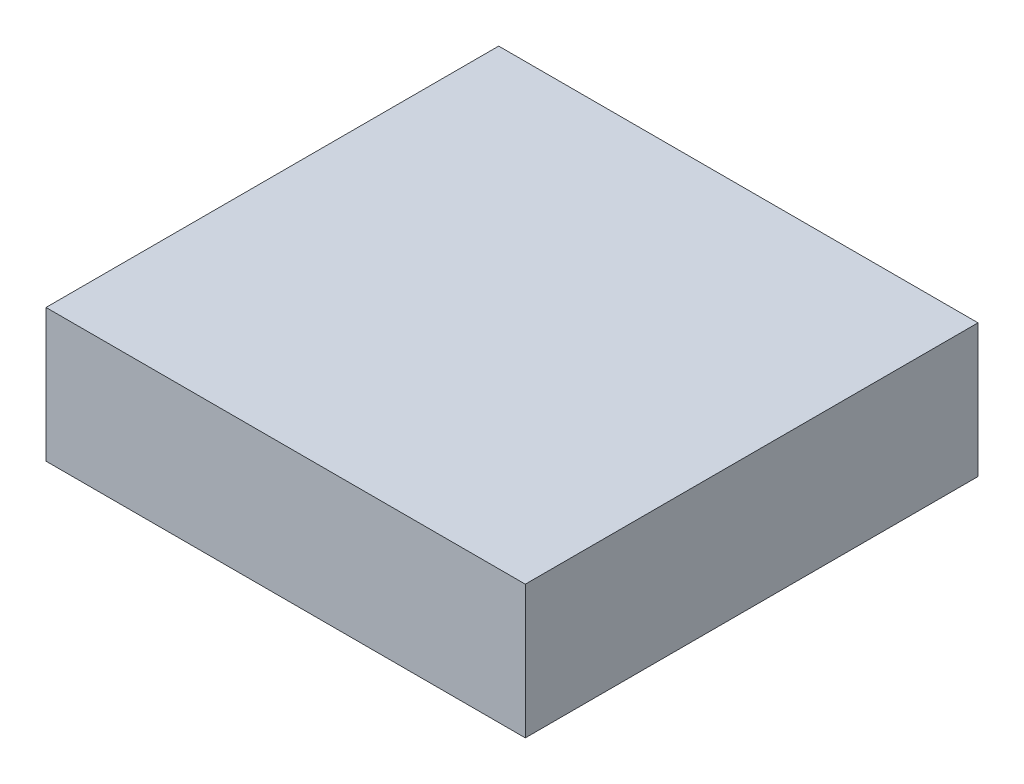
ISO-10303-21;
HEADER;
FILE_DESCRIPTION(('STEP AP214'),'2;1');
FILE_NAME('part.step','',(''),(''),'','','');
FILE_SCHEMA(('AUTOMOTIVE_DESIGN { 1 0 10303 214 1 1 1 1 }'));
ENDSEC;
DATA;
#1=APPLICATION_CONTEXT('core data for automotive mechanical design processes');
#2=APPLICATION_PROTOCOL_DEFINITION('international standard','automotive_design',2000,#1);
#3=PRODUCT_CONTEXT('',#1,'mechanical');
#4=PRODUCT('Part','Part','',(#3));
#5=PRODUCT_RELATED_PRODUCT_CATEGORY('part','',(#4));
#6=PRODUCT_DEFINITION_FORMATION('','',#4);
#7=PRODUCT_DEFINITION_CONTEXT('part definition',#1,'design');
#8=PRODUCT_DEFINITION('design','',#6,#7);
#9=PRODUCT_DEFINITION_SHAPE('','',#8);
#10=(LENGTH_UNIT() NAMED_UNIT(*) SI_UNIT(.MILLI.,.METRE.));
#11=(NAMED_UNIT(*) PLANE_ANGLE_UNIT() SI_UNIT($,.RADIAN.));
#12=(NAMED_UNIT(*) SI_UNIT($,.STERADIAN.) SOLID_ANGLE_UNIT());
#13=UNCERTAINTY_MEASURE_WITH_UNIT(LENGTH_MEASURE(1.E-05),#10,'distance_accuracy_value','');
#14=(GEOMETRIC_REPRESENTATION_CONTEXT(3) GLOBAL_UNCERTAINTY_ASSIGNED_CONTEXT((#13)) GLOBAL_UNIT_ASSIGNED_CONTEXT((#10,
#11,#12)) REPRESENTATION_CONTEXT('',''));
#15=CARTESIAN_POINT('',(0.,0.,0.));
#16=DIRECTION('',(0.,0.,1.));
#17=DIRECTION('',(1.,0.,0.));
#18=AXIS2_PLACEMENT_3D('',#15,#16,#17);
#19=CARTESIAN_POINT('',(-0.8999982,-0.2499995,1.69999914));
#20=DIRECTION('',(0.,0.,-1.));
#21=DIRECTION('',(0.,-1.,0.));
#22=AXIS2_PLACEMENT_3D('',#19,#20,#21);
#23=PLANE('',#22);
#24=DIRECTION('',(1.,0.,0.));
#25=VECTOR('',#24,1.);
#26=CARTESIAN_POINT('',(-0.8999982,-0.2499995,1.69999914));
#27=LINE('',#26,#25);
#28=CARTESIAN_POINT('',(-0.8999982,-0.2499995,1.69999914));
#29=VERTEX_POINT('',#28);
#30=CARTESIAN_POINT('',(0.90000074,-0.2499995,1.69999914));
#31=VERTEX_POINT('',#30);
#32=EDGE_CURVE('E88',#29,#31,#27,.T.);
#33=ORIENTED_EDGE('',*,*,#32,.T.);
#34=DIRECTION('',(0.,1.,0.));
#35=VECTOR('',#34,1.);
#36=CARTESIAN_POINT('',(0.90000074,-0.2499995,1.69999914));
#37=LINE('',#36,#35);
#38=CARTESIAN_POINT('',(0.90000074,0.25000204,1.69999914));
#39=VERTEX_POINT('',#38);
#40=EDGE_CURVE('E62',#31,#39,#37,.T.);
#41=ORIENTED_EDGE('',*,*,#40,.T.);
#42=DIRECTION('',(-1.,0.,0.));
#43=VECTOR('',#42,1.);
#44=CARTESIAN_POINT('',(0.90000074,0.25000204,1.69999914));
#45=LINE('',#44,#43);
#46=CARTESIAN_POINT('',(-0.8999982,0.25000204,1.69999914));
#47=VERTEX_POINT('',#46);
#48=EDGE_CURVE('E80',#39,#47,#45,.T.);
#49=ORIENTED_EDGE('',*,*,#48,.T.);
#50=DIRECTION('',(0.,-1.,0.));
#51=VECTOR('',#50,1.);
#52=CARTESIAN_POINT('',(-0.8999982,0.25000204,1.69999914));
#53=LINE('',#52,#51);
#54=EDGE_CURVE('E11',#47,#29,#53,.T.);
#55=ORIENTED_EDGE('',*,*,#54,.T.);
#56=EDGE_LOOP('',(#33,#41,#49,#55));
#57=FACE_BOUND('',#56,.T.);
#58=ADVANCED_FACE('F16',(#57),#23,.F.);
#59=CARTESIAN_POINT('',(-0.8999982,-0.2499995,0.));
#60=DIRECTION('',(0.,0.,-1.));
#61=DIRECTION('',(0.,-1.,0.));
#62=AXIS2_PLACEMENT_3D('',#59,#60,#61);
#63=PLANE('',#62);
#64=DIRECTION('',(0.,-1.,0.));
#65=VECTOR('',#64,1.);
#66=CARTESIAN_POINT('',(-0.8999982,0.25000204,0.));
#67=LINE('',#66,#65);
#68=CARTESIAN_POINT('',(-0.8999982,0.25000204,0.));
#69=VERTEX_POINT('',#68);
#70=CARTESIAN_POINT('',(-0.8999982,-0.2499995,0.));
#71=VERTEX_POINT('',#70);
#72=EDGE_CURVE('E27',#69,#71,#67,.T.);
#73=ORIENTED_EDGE('',*,*,#72,.F.);
#74=DIRECTION('',(-1.,0.,0.));
#75=VECTOR('',#74,1.);
#76=CARTESIAN_POINT('',(0.90000074,0.25000204,0.));
#77=LINE('',#76,#75);
#78=CARTESIAN_POINT('',(0.90000074,0.25000204,0.));
#79=VERTEX_POINT('',#78);
#80=EDGE_CURVE('E20',#79,#69,#77,.T.);
#81=ORIENTED_EDGE('',*,*,#80,.F.);
#82=DIRECTION('',(0.,1.,0.));
#83=VECTOR('',#82,1.);
#84=CARTESIAN_POINT('',(0.90000074,-0.2499995,0.));
#85=LINE('',#84,#83);
#86=CARTESIAN_POINT('',(0.90000074,-0.2499995,0.));
#87=VERTEX_POINT('',#86);
#88=EDGE_CURVE('E93',#87,#79,#85,.T.);
#89=ORIENTED_EDGE('',*,*,#88,.F.);
#90=DIRECTION('',(1.,0.,0.));
#91=VECTOR('',#90,1.);
#92=CARTESIAN_POINT('',(-0.8999982,-0.2499995,0.));
#93=LINE('',#92,#91);
#94=EDGE_CURVE('E108',#71,#87,#93,.T.);
#95=ORIENTED_EDGE('',*,*,#94,.F.);
#96=EDGE_LOOP('',(#73,#81,#89,#95));
#97=FACE_BOUND('',#96,.T.);
#98=ADVANCED_FACE('F171',(#97),#63,.T.);
#99=CARTESIAN_POINT('',(-0.8999982,0.25000204,0.));
#100=DIRECTION('',(1.,0.,0.));
#101=DIRECTION('',(0.,1.,0.));
#102=AXIS2_PLACEMENT_3D('',#99,#100,#101);
#103=PLANE('',#102);
#104=ORIENTED_EDGE('',*,*,#72,.T.);
#105=DIRECTION('',(0.,0.,1.));
#106=VECTOR('',#105,1.);
#107=CARTESIAN_POINT('',(-0.8999982,-0.2499995,0.));
#108=LINE('',#107,#106);
#109=EDGE_CURVE('E100',#71,#29,#108,.T.);
#110=ORIENTED_EDGE('',*,*,#109,.T.);
#111=ORIENTED_EDGE('',*,*,#54,.F.);
#112=DIRECTION('',(0.,0.,1.));
#113=VECTOR('',#112,1.);
#114=CARTESIAN_POINT('',(-0.8999982,0.25000204,0.));
#115=LINE('',#114,#113);
#116=EDGE_CURVE('E84',#69,#47,#115,.T.);
#117=ORIENTED_EDGE('',*,*,#116,.F.);
#118=EDGE_LOOP('',(#104,#110,#111,#117));
#119=FACE_BOUND('',#118,.T.);
#120=ADVANCED_FACE('F18',(#119),#103,.F.);
#121=CARTESIAN_POINT('',(0.90000074,0.25000204,0.));
#122=DIRECTION('',(0.,-1.,0.));
#123=DIRECTION('',(0.,0.,-1.));
#124=AXIS2_PLACEMENT_3D('',#121,#122,#123);
#125=PLANE('',#124);
#126=ORIENTED_EDGE('',*,*,#80,.T.);
#127=ORIENTED_EDGE('',*,*,#116,.T.);
#128=ORIENTED_EDGE('',*,*,#48,.F.);
#129=DIRECTION('',(0.,0.,1.));
#130=VECTOR('',#129,1.);
#131=CARTESIAN_POINT('',(0.90000074,0.25000204,0.));
#132=LINE('',#131,#130);
#133=EDGE_CURVE('E82',#79,#39,#132,.T.);
#134=ORIENTED_EDGE('',*,*,#133,.F.);
#135=EDGE_LOOP('',(#126,#127,#128,#134));
#136=FACE_BOUND('',#135,.T.);
#137=ADVANCED_FACE('F81',(#136),#125,.F.);
#138=CARTESIAN_POINT('',(0.90000074,-0.2499995,0.));
#139=DIRECTION('',(-1.,0.,0.));
#140=DIRECTION('',(0.,0.,1.));
#141=AXIS2_PLACEMENT_3D('',#138,#139,#140);
#142=PLANE('',#141);
#143=ORIENTED_EDGE('',*,*,#88,.T.);
#144=ORIENTED_EDGE('',*,*,#133,.T.);
#145=ORIENTED_EDGE('',*,*,#40,.F.);
#146=DIRECTION('',(0.,0.,1.));
#147=VECTOR('',#146,1.);
#148=CARTESIAN_POINT('',(0.90000074,-0.2499995,0.));
#149=LINE('',#148,#147);
#150=EDGE_CURVE('E111',#87,#31,#149,.T.);
#151=ORIENTED_EDGE('',*,*,#150,.F.);
#152=EDGE_LOOP('',(#143,#144,#145,#151));
#153=FACE_BOUND('',#152,.T.);
#154=ADVANCED_FACE('F92',(#153),#142,.F.);
#155=CARTESIAN_POINT('',(-0.8999982,-0.2499995,0.));
#156=DIRECTION('',(0.,1.,0.));
#157=DIRECTION('',(1.,0.,0.));
#158=AXIS2_PLACEMENT_3D('',#155,#156,#157);
#159=PLANE('',#158);
#160=ORIENTED_EDGE('',*,*,#94,.T.);
#161=ORIENTED_EDGE('',*,*,#150,.T.);
#162=ORIENTED_EDGE('',*,*,#32,.F.);
#163=ORIENTED_EDGE('',*,*,#109,.F.);
#164=EDGE_LOOP('',(#160,#161,#162,#163));
#165=FACE_BOUND('',#164,.T.);
#166=ADVANCED_FACE('F155',(#165),#159,.F.);
#167=CLOSED_SHELL('',(#58,#98,#120,#137,#154,#166));
#168=MANIFOLD_SOLID_BREP('B1',#167);
#169=ADVANCED_BREP_SHAPE_REPRESENTATION('',(#18,#168),#14);
#170=SHAPE_DEFINITION_REPRESENTATION(#9,#169);
ENDSEC;
END-ISO-10303-21;
